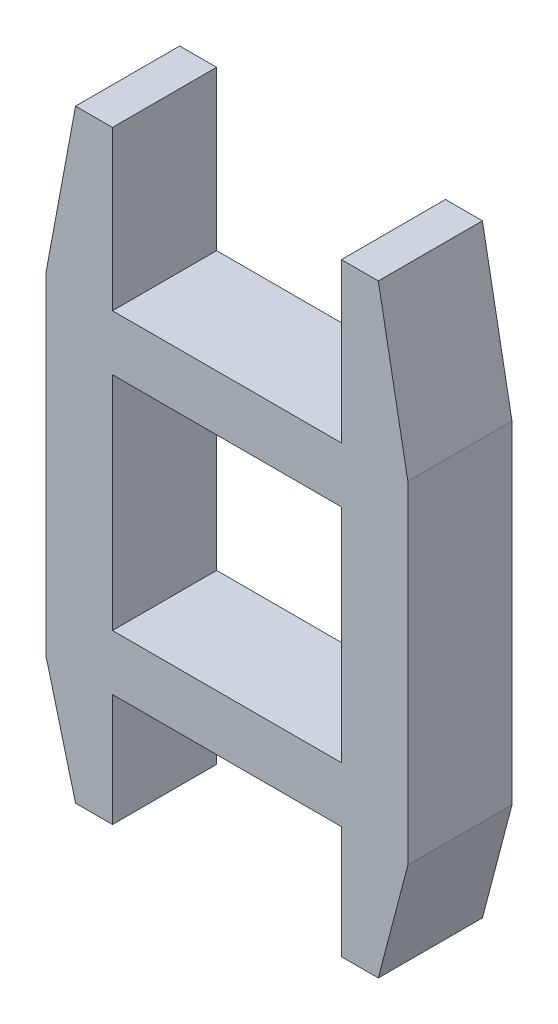
ISO-10303-21;
HEADER;
FILE_DESCRIPTION(('STEP AP214'),'2;1');
FILE_NAME('part.step','',(''),(''),'','','');
FILE_SCHEMA(('AUTOMOTIVE_DESIGN { 1 0 10303 214 1 1 1 1 }'));
ENDSEC;
DATA;
#1=APPLICATION_CONTEXT('core data for automotive mechanical design processes');
#2=APPLICATION_PROTOCOL_DEFINITION('international standard','automotive_design',2000,#1);
#3=PRODUCT_CONTEXT('',#1,'mechanical');
#4=PRODUCT('Part','Part','',(#3));
#5=PRODUCT_RELATED_PRODUCT_CATEGORY('part','',(#4));
#6=PRODUCT_DEFINITION_FORMATION('','',#4);
#7=PRODUCT_DEFINITION_CONTEXT('part definition',#1,'design');
#8=PRODUCT_DEFINITION('design','',#6,#7);
#9=PRODUCT_DEFINITION_SHAPE('','',#8);
#10=(LENGTH_UNIT() NAMED_UNIT(*) SI_UNIT(.MILLI.,.METRE.));
#11=(NAMED_UNIT(*) PLANE_ANGLE_UNIT() SI_UNIT($,.RADIAN.));
#12=(NAMED_UNIT(*) SI_UNIT($,.STERADIAN.) SOLID_ANGLE_UNIT());
#13=UNCERTAINTY_MEASURE_WITH_UNIT(LENGTH_MEASURE(1.E-05),#10,'distance_accuracy_value','');
#14=(GEOMETRIC_REPRESENTATION_CONTEXT(3) GLOBAL_UNCERTAINTY_ASSIGNED_CONTEXT((#13)) GLOBAL_UNIT_ASSIGNED_CONTEXT((#10,
#11,#12)) REPRESENTATION_CONTEXT('',''));
#15=CARTESIAN_POINT('',(0.,0.,0.));
#16=DIRECTION('',(0.,0.,1.));
#17=DIRECTION('',(1.,0.,0.));
#18=AXIS2_PLACEMENT_3D('',#15,#16,#17);
#19=CARTESIAN_POINT('',(1247.20962355286,946.877195660845,5.64));
#20=DIRECTION('',(0.,0.,1.));
#21=DIRECTION('',(1.,0.,0.));
#22=AXIS2_PLACEMENT_3D('',#19,#20,#21);
#23=PLANE('',#22);
#24=DIRECTION('',(0.,1.,0.));
#25=VECTOR('',#24,1.);
#26=CARTESIAN_POINT('',(1247.20962355286,940.777195660845,5.64));
#27=LINE('',#26,#25);
#28=CARTESIAN_POINT('',(1247.20962355286,940.777195660845,5.64));
#29=VERTEX_POINT('',#28);
#30=CARTESIAN_POINT('',(1247.20962355286,946.877195660845,5.64));
#31=VERTEX_POINT('',#30);
#32=EDGE_CURVE('E206',#29,#31,#27,.T.);
#33=ORIENTED_EDGE('',*,*,#32,.T.);
#34=DIRECTION('',(1.,0.,0.));
#35=VECTOR('',#34,1.);
#36=CARTESIAN_POINT('',(1259.60962355286,946.877195660845,5.64));
#37=LINE('',#36,#35);
#38=CARTESIAN_POINT('',(1259.60962355286,946.877195660845,5.64));
#39=VERTEX_POINT('',#38);
#40=EDGE_CURVE('E209',#31,#39,#37,.T.);
#41=ORIENTED_EDGE('',*,*,#40,.T.);
#42=DIRECTION('',(0.,-1.,0.));
#43=VECTOR('',#42,1.);
#44=CARTESIAN_POINT('',(1259.60962355286,940.777195660845,5.64));
#45=LINE('',#44,#43);
#46=CARTESIAN_POINT('',(1259.60962355286,940.777195660845,5.64));
#47=VERTEX_POINT('',#46);
#48=EDGE_CURVE('E212',#39,#47,#45,.T.);
#49=ORIENTED_EDGE('',*,*,#48,.T.);
#50=DIRECTION('',(1.,0.,0.));
#51=VECTOR('',#50,1.);
#52=CARTESIAN_POINT('',(1261.60962355286,940.777195660845,5.64));
#53=LINE('',#52,#51);
#54=CARTESIAN_POINT('',(1261.60962355286,940.777195660845,5.64));
#55=VERTEX_POINT('',#54);
#56=EDGE_CURVE('E214',#47,#55,#53,.T.);
#57=ORIENTED_EDGE('',*,*,#56,.T.);
#58=DIRECTION('',(0.253712688364942,0.967279624391331,0.));
#59=VECTOR('',#58,1.);
#60=CARTESIAN_POINT('',(1263.20962355286,946.877195660845,5.64));
#61=LINE('',#60,#59);
#62=CARTESIAN_POINT('',(1263.20962355286,946.877195660845,5.64));
#63=VERTEX_POINT('',#62);
#64=EDGE_CURVE('E216',#55,#63,#61,.T.);
#65=ORIENTED_EDGE('',*,*,#64,.T.);
#66=DIRECTION('',(0.,1.,0.));
#67=VECTOR('',#66,1.);
#68=CARTESIAN_POINT('',(1263.20962355286,964.877195660845,5.64));
#69=LINE('',#68,#67);
#70=CARTESIAN_POINT('',(1263.20962355286,964.877195660845,5.64));
#71=VERTEX_POINT('',#70);
#72=EDGE_CURVE('E218',#63,#71,#69,.T.);
#73=ORIENTED_EDGE('',*,*,#72,.T.);
#74=DIRECTION('',(-0.182907916182994,0.983130049483584,0.));
#75=VECTOR('',#74,1.);
#76=CARTESIAN_POINT('',(1263.20962355286,964.877195660845,5.64));
#77=LINE('',#76,#75);
#78=CARTESIAN_POINT('',(1261.60962355286,973.477195660846,5.64));
#79=VERTEX_POINT('',#78);
#80=EDGE_CURVE('E220',#71,#79,#77,.T.);
#81=ORIENTED_EDGE('',*,*,#80,.T.);
#82=DIRECTION('',(-1.,0.,0.));
#83=VECTOR('',#82,1.);
#84=CARTESIAN_POINT('',(1261.60962355286,973.477195660846,5.64));
#85=LINE('',#84,#83);
#86=CARTESIAN_POINT('',(1259.60962355286,973.477195660846,5.64));
#87=VERTEX_POINT('',#86);
#88=EDGE_CURVE('E222',#79,#87,#85,.T.);
#89=ORIENTED_EDGE('',*,*,#88,.T.);
#90=DIRECTION('',(0.,-1.,0.));
#91=VECTOR('',#90,1.);
#92=CARTESIAN_POINT('',(1259.60962355286,973.477195660846,5.64));
#93=LINE('',#92,#91);
#94=CARTESIAN_POINT('',(1259.60962355286,964.877195660845,5.64));
#95=VERTEX_POINT('',#94);
#96=EDGE_CURVE('E224',#87,#95,#93,.T.);
#97=ORIENTED_EDGE('',*,*,#96,.T.);
#98=DIRECTION('',(-1.,0.,0.));
#99=VECTOR('',#98,1.);
#100=CARTESIAN_POINT('',(1259.60962355286,964.877195660845,5.64));
#101=LINE('',#100,#99);
#102=CARTESIAN_POINT('',(1247.20962355286,964.877195660845,5.64));
#103=VERTEX_POINT('',#102);
#104=EDGE_CURVE('E226',#95,#103,#101,.T.);
#105=ORIENTED_EDGE('',*,*,#104,.T.);
#106=DIRECTION('',(0.,1.,0.));
#107=VECTOR('',#106,1.);
#108=CARTESIAN_POINT('',(1247.20962355286,973.477195660846,5.64));
#109=LINE('',#108,#107);
#110=CARTESIAN_POINT('',(1247.20962355286,973.477195660846,5.64));
#111=VERTEX_POINT('',#110);
#112=EDGE_CURVE('E228',#103,#111,#109,.T.);
#113=ORIENTED_EDGE('',*,*,#112,.T.);
#114=DIRECTION('',(-1.,0.,0.));
#115=VECTOR('',#114,1.);
#116=CARTESIAN_POINT('',(1245.20962355286,973.477195660846,5.64));
#117=LINE('',#116,#115);
#118=CARTESIAN_POINT('',(1245.20962355286,973.477195660846,5.64));
#119=VERTEX_POINT('',#118);
#120=EDGE_CURVE('E230',#111,#119,#117,.T.);
#121=ORIENTED_EDGE('',*,*,#120,.T.);
#122=DIRECTION('',(-0.182907916182994,-0.983130049483584,0.));
#123=VECTOR('',#122,1.);
#124=CARTESIAN_POINT('',(1243.60962355286,964.877195660845,5.64));
#125=LINE('',#124,#123);
#126=CARTESIAN_POINT('',(1243.60962355286,964.877195660845,5.64));
#127=VERTEX_POINT('',#126);
#128=EDGE_CURVE('E232',#119,#127,#125,.T.);
#129=ORIENTED_EDGE('',*,*,#128,.T.);
#130=DIRECTION('',(0.,-1.,0.));
#131=VECTOR('',#130,1.);
#132=CARTESIAN_POINT('',(1243.60962355286,964.877195660845,5.64));
#133=LINE('',#132,#131);
#134=CARTESIAN_POINT('',(1243.60962355286,946.877195660845,5.64));
#135=VERTEX_POINT('',#134);
#136=EDGE_CURVE('E234',#127,#135,#133,.T.);
#137=ORIENTED_EDGE('',*,*,#136,.T.);
#138=DIRECTION('',(0.253712688364942,-0.967279624391331,0.));
#139=VECTOR('',#138,1.);
#140=CARTESIAN_POINT('',(1243.60962355286,946.877195660845,5.64));
#141=LINE('',#140,#139);
#142=CARTESIAN_POINT('',(1245.20962355286,940.777195660845,5.64));
#143=VERTEX_POINT('',#142);
#144=EDGE_CURVE('E236',#135,#143,#141,.T.);
#145=ORIENTED_EDGE('',*,*,#144,.T.);
#146=DIRECTION('',(1.,0.,0.));
#147=VECTOR('',#146,1.);
#148=CARTESIAN_POINT('',(1245.20962355286,940.777195660845,5.64));
#149=LINE('',#148,#147);
#150=EDGE_CURVE('E238',#143,#29,#149,.T.);
#151=ORIENTED_EDGE('',*,*,#150,.T.);
#152=EDGE_LOOP('',(#33,#41,#49,#57,#65,#73,#81,#89,#97,#105,#113,#121,#129,#137,#145,#151));
#153=FACE_BOUND('',#152,.T.);
#154=DIRECTION('',(-1.,0.,0.));
#155=VECTOR('',#154,1.);
#156=CARTESIAN_POINT('',(1247.20962355286,961.877195660845,5.64));
#157=LINE('',#156,#155);
#158=CARTESIAN_POINT('',(1259.60962355286,961.877195660845,5.64));
#159=VERTEX_POINT('',#158);
#160=CARTESIAN_POINT('',(1247.20962355286,961.877195660845,5.64));
#161=VERTEX_POINT('',#160);
#162=EDGE_CURVE('E178',#159,#161,#157,.T.);
#163=ORIENTED_EDGE('',*,*,#162,.F.);
#164=DIRECTION('',(0.,1.,0.));
#165=VECTOR('',#164,1.);
#166=CARTESIAN_POINT('',(1259.60962355286,961.877195660845,5.64));
#167=LINE('',#166,#165);
#168=CARTESIAN_POINT('',(1259.60962355286,949.877195660845,5.64));
#169=VERTEX_POINT('',#168);
#170=EDGE_CURVE('E170',#169,#159,#167,.T.);
#171=ORIENTED_EDGE('',*,*,#170,.F.);
#172=DIRECTION('',(1.,0.,0.));
#173=VECTOR('',#172,1.);
#174=CARTESIAN_POINT('',(1247.20962355286,949.877195660845,5.64));
#175=LINE('',#174,#173);
#176=CARTESIAN_POINT('',(1247.20962355286,949.877195660845,5.64));
#177=VERTEX_POINT('',#176);
#178=EDGE_CURVE('E192',#177,#169,#175,.T.);
#179=ORIENTED_EDGE('',*,*,#178,.F.);
#180=DIRECTION('',(0.,-1.,0.));
#181=VECTOR('',#180,1.);
#182=CARTESIAN_POINT('',(1247.20962355286,961.877195660845,5.64));
#183=LINE('',#182,#181);
#184=EDGE_CURVE('E190',#161,#177,#183,.T.);
#185=ORIENTED_EDGE('',*,*,#184,.F.);
#186=EDGE_LOOP('',(#163,#171,#179,#185));
#187=FACE_BOUND('',#186,.T.);
#188=ADVANCED_FACE('F33',(#153,#187),#23,.T.);
#189=CARTESIAN_POINT('',(1247.20962355286,946.877195660845,0.));
#190=DIRECTION('',(0.,0.,1.));
#191=DIRECTION('',(1.,0.,0.));
#192=AXIS2_PLACEMENT_3D('',#189,#190,#191);
#193=PLANE('',#192);
#194=DIRECTION('',(0.,1.,0.));
#195=VECTOR('',#194,1.);
#196=CARTESIAN_POINT('',(1247.20962355286,940.777195660845,0.));
#197=LINE('',#196,#195);
#198=CARTESIAN_POINT('',(1247.20962355286,940.777195660845,0.));
#199=VERTEX_POINT('',#198);
#200=CARTESIAN_POINT('',(1247.20962355286,946.877195660845,0.));
#201=VERTEX_POINT('',#200);
#202=EDGE_CURVE('E186',#199,#201,#197,.T.);
#203=ORIENTED_EDGE('',*,*,#202,.F.);
#204=DIRECTION('',(1.,0.,0.));
#205=VECTOR('',#204,1.);
#206=CARTESIAN_POINT('',(1245.20962355286,940.777195660845,0.));
#207=LINE('',#206,#205);
#208=CARTESIAN_POINT('',(1245.20962355286,940.777195660845,0.));
#209=VERTEX_POINT('',#208);
#210=EDGE_CURVE('E210',#209,#199,#207,.T.);
#211=ORIENTED_EDGE('',*,*,#210,.F.);
#212=DIRECTION('',(0.253712688364942,-0.967279624391331,0.));
#213=VECTOR('',#212,1.);
#214=CARTESIAN_POINT('',(1243.60962355286,946.877195660845,0.));
#215=LINE('',#214,#213);
#216=CARTESIAN_POINT('',(1243.60962355286,946.877195660845,0.));
#217=VERTEX_POINT('',#216);
#218=EDGE_CURVE('E269',#217,#209,#215,.T.);
#219=ORIENTED_EDGE('',*,*,#218,.F.);
#220=DIRECTION('',(0.,-1.,0.));
#221=VECTOR('',#220,1.);
#222=CARTESIAN_POINT('',(1243.60962355286,964.877195660845,0.));
#223=LINE('',#222,#221);
#224=CARTESIAN_POINT('',(1243.60962355286,964.877195660845,0.));
#225=VERTEX_POINT('',#224);
#226=EDGE_CURVE('E267',#225,#217,#223,.T.);
#227=ORIENTED_EDGE('',*,*,#226,.F.);
#228=DIRECTION('',(-0.182907916182994,-0.983130049483584,0.));
#229=VECTOR('',#228,1.);
#230=CARTESIAN_POINT('',(1243.60962355286,964.877195660845,0.));
#231=LINE('',#230,#229);
#232=CARTESIAN_POINT('',(1245.20962355286,973.477195660846,0.));
#233=VERTEX_POINT('',#232);
#234=EDGE_CURVE('E265',#233,#225,#231,.T.);
#235=ORIENTED_EDGE('',*,*,#234,.F.);
#236=DIRECTION('',(-1.,0.,0.));
#237=VECTOR('',#236,1.);
#238=CARTESIAN_POINT('',(1245.20962355286,973.477195660846,0.));
#239=LINE('',#238,#237);
#240=CARTESIAN_POINT('',(1247.20962355286,973.477195660846,0.));
#241=VERTEX_POINT('',#240);
#242=EDGE_CURVE('E263',#241,#233,#239,.T.);
#243=ORIENTED_EDGE('',*,*,#242,.F.);
#244=DIRECTION('',(0.,1.,0.));
#245=VECTOR('',#244,1.);
#246=CARTESIAN_POINT('',(1247.20962355286,973.477195660846,0.));
#247=LINE('',#246,#245);
#248=CARTESIAN_POINT('',(1247.20962355286,964.877195660845,0.));
#249=VERTEX_POINT('',#248);
#250=EDGE_CURVE('E261',#249,#241,#247,.T.);
#251=ORIENTED_EDGE('',*,*,#250,.F.);
#252=DIRECTION('',(-1.,0.,0.));
#253=VECTOR('',#252,1.);
#254=CARTESIAN_POINT('',(1259.60962355286,964.877195660845,0.));
#255=LINE('',#254,#253);
#256=CARTESIAN_POINT('',(1259.60962355286,964.877195660845,0.));
#257=VERTEX_POINT('',#256);
#258=EDGE_CURVE('E259',#257,#249,#255,.T.);
#259=ORIENTED_EDGE('',*,*,#258,.F.);
#260=DIRECTION('',(0.,-1.,0.));
#261=VECTOR('',#260,1.);
#262=CARTESIAN_POINT('',(1259.60962355286,973.477195660846,0.));
#263=LINE('',#262,#261);
#264=CARTESIAN_POINT('',(1259.60962355286,973.477195660846,0.));
#265=VERTEX_POINT('',#264);
#266=EDGE_CURVE('E257',#265,#257,#263,.T.);
#267=ORIENTED_EDGE('',*,*,#266,.F.);
#268=DIRECTION('',(-1.,0.,0.));
#269=VECTOR('',#268,1.);
#270=CARTESIAN_POINT('',(1261.60962355286,973.477195660846,0.));
#271=LINE('',#270,#269);
#272=CARTESIAN_POINT('',(1261.60962355286,973.477195660846,0.));
#273=VERTEX_POINT('',#272);
#274=EDGE_CURVE('E255',#273,#265,#271,.T.);
#275=ORIENTED_EDGE('',*,*,#274,.F.);
#276=DIRECTION('',(-0.182907916182994,0.983130049483584,0.));
#277=VECTOR('',#276,1.);
#278=CARTESIAN_POINT('',(1263.20962355286,964.877195660845,0.));
#279=LINE('',#278,#277);
#280=CARTESIAN_POINT('',(1263.20962355286,964.877195660845,0.));
#281=VERTEX_POINT('',#280);
#282=EDGE_CURVE('E253',#281,#273,#279,.T.);
#283=ORIENTED_EDGE('',*,*,#282,.F.);
#284=DIRECTION('',(0.,1.,0.));
#285=VECTOR('',#284,1.);
#286=CARTESIAN_POINT('',(1263.20962355286,964.877195660845,0.));
#287=LINE('',#286,#285);
#288=CARTESIAN_POINT('',(1263.20962355286,946.877195660845,0.));
#289=VERTEX_POINT('',#288);
#290=EDGE_CURVE('E251',#289,#281,#287,.T.);
#291=ORIENTED_EDGE('',*,*,#290,.F.);
#292=DIRECTION('',(0.253712688364942,0.967279624391331,0.));
#293=VECTOR('',#292,1.);
#294=CARTESIAN_POINT('',(1263.20962355286,946.877195660845,0.));
#295=LINE('',#294,#293);
#296=CARTESIAN_POINT('',(1261.60962355286,940.777195660845,0.));
#297=VERTEX_POINT('',#296);
#298=EDGE_CURVE('E249',#297,#289,#295,.T.);
#299=ORIENTED_EDGE('',*,*,#298,.F.);
#300=DIRECTION('',(1.,0.,0.));
#301=VECTOR('',#300,1.);
#302=CARTESIAN_POINT('',(1261.60962355286,940.777195660845,0.));
#303=LINE('',#302,#301);
#304=CARTESIAN_POINT('',(1259.60962355286,940.777195660845,0.));
#305=VERTEX_POINT('',#304);
#306=EDGE_CURVE('E247',#305,#297,#303,.T.);
#307=ORIENTED_EDGE('',*,*,#306,.F.);
#308=DIRECTION('',(0.,-1.,0.));
#309=VECTOR('',#308,1.);
#310=CARTESIAN_POINT('',(1259.60962355286,940.777195660845,0.));
#311=LINE('',#310,#309);
#312=CARTESIAN_POINT('',(1259.60962355286,946.877195660845,0.));
#313=VERTEX_POINT('',#312);
#314=EDGE_CURVE('E245',#313,#305,#311,.T.);
#315=ORIENTED_EDGE('',*,*,#314,.F.);
#316=DIRECTION('',(1.,0.,0.));
#317=VECTOR('',#316,1.);
#318=CARTESIAN_POINT('',(1259.60962355286,946.877195660845,0.));
#319=LINE('',#318,#317);
#320=EDGE_CURVE('E243',#201,#313,#319,.T.);
#321=ORIENTED_EDGE('',*,*,#320,.F.);
#322=EDGE_LOOP('',(#203,#211,#219,#227,#235,#243,#251,#259,#267,#275,#283,#291,#299,#307,#315,#321));
#323=FACE_BOUND('',#322,.T.);
#324=DIRECTION('',(0.,1.,0.));
#325=VECTOR('',#324,1.);
#326=CARTESIAN_POINT('',(1259.60962355286,961.877195660845,0.));
#327=LINE('',#326,#325);
#328=CARTESIAN_POINT('',(1259.60962355286,949.877195660845,0.));
#329=VERTEX_POINT('',#328);
#330=CARTESIAN_POINT('',(1259.60962355286,961.877195660845,0.));
#331=VERTEX_POINT('',#330);
#332=EDGE_CURVE('E56',#329,#331,#327,.T.);
#333=ORIENTED_EDGE('',*,*,#332,.T.);
#334=DIRECTION('',(-1.,0.,0.));
#335=VECTOR('',#334,1.);
#336=CARTESIAN_POINT('',(1247.20962355286,961.877195660845,0.));
#337=LINE('',#336,#335);
#338=CARTESIAN_POINT('',(1247.20962355286,961.877195660845,0.));
#339=VERTEX_POINT('',#338);
#340=EDGE_CURVE('E185',#331,#339,#337,.T.);
#341=ORIENTED_EDGE('',*,*,#340,.T.);
#342=DIRECTION('',(0.,-1.,0.));
#343=VECTOR('',#342,1.);
#344=CARTESIAN_POINT('',(1247.20962355286,961.877195660845,0.));
#345=LINE('',#344,#343);
#346=CARTESIAN_POINT('',(1247.20962355286,949.877195660845,0.));
#347=VERTEX_POINT('',#346);
#348=EDGE_CURVE('E198',#339,#347,#345,.T.);
#349=ORIENTED_EDGE('',*,*,#348,.T.);
#350=DIRECTION('',(1.,0.,0.));
#351=VECTOR('',#350,1.);
#352=CARTESIAN_POINT('',(1247.20962355286,949.877195660845,0.));
#353=LINE('',#352,#351);
#354=EDGE_CURVE('E179',#347,#329,#353,.T.);
#355=ORIENTED_EDGE('',*,*,#354,.T.);
#356=EDGE_LOOP('',(#333,#341,#349,#355));
#357=FACE_BOUND('',#356,.T.);
#358=ADVANCED_FACE('F323',(#323,#357),#193,.F.);
#359=CARTESIAN_POINT('',(1247.20962355286,940.777195660845,5.64));
#360=DIRECTION('',(-1.,0.,0.));
#361=DIRECTION('',(0.,-1.,0.));
#362=AXIS2_PLACEMENT_3D('',#359,#360,#361);
#363=PLANE('',#362);
#364=ORIENTED_EDGE('',*,*,#202,.T.);
#365=DIRECTION('',(0.,0.,-1.));
#366=VECTOR('',#365,1.);
#367=CARTESIAN_POINT('',(1247.20962355286,946.877195660845,5.64));
#368=LINE('',#367,#366);
#369=EDGE_CURVE('E11',#31,#201,#368,.T.);
#370=ORIENTED_EDGE('',*,*,#369,.F.);
#371=ORIENTED_EDGE('',*,*,#32,.F.);
#372=DIRECTION('',(0.,0.,-1.));
#373=VECTOR('',#372,1.);
#374=CARTESIAN_POINT('',(1247.20962355286,940.777195660845,5.64));
#375=LINE('',#374,#373);
#376=EDGE_CURVE('E240',#29,#199,#375,.T.);
#377=ORIENTED_EDGE('',*,*,#376,.T.);
#378=EDGE_LOOP('',(#364,#370,#371,#377));
#379=FACE_BOUND('',#378,.T.);
#380=ADVANCED_FACE('F35',(#379),#363,.F.);
#381=CARTESIAN_POINT('',(1259.60962355286,946.877195660845,5.64));
#382=DIRECTION('',(0.,1.,0.));
#383=DIRECTION('',(0.,0.,1.));
#384=AXIS2_PLACEMENT_3D('',#381,#382,#383);
#385=PLANE('',#384);
#386=ORIENTED_EDGE('',*,*,#320,.T.);
#387=DIRECTION('',(0.,0.,-1.));
#388=VECTOR('',#387,1.);
#389=CARTESIAN_POINT('',(1259.60962355286,946.877195660845,5.64));
#390=LINE('',#389,#388);
#391=EDGE_CURVE('E41',#39,#313,#390,.T.);
#392=ORIENTED_EDGE('',*,*,#391,.F.);
#393=ORIENTED_EDGE('',*,*,#40,.F.);
#394=ORIENTED_EDGE('',*,*,#369,.T.);
#395=EDGE_LOOP('',(#386,#392,#393,#394));
#396=FACE_BOUND('',#395,.T.);
#397=ADVANCED_FACE('F340',(#396),#385,.F.);
#398=CARTESIAN_POINT('',(1259.60962355286,940.777195660845,5.64));
#399=DIRECTION('',(1.,0.,0.));
#400=DIRECTION('',(0.,1.,0.));
#401=AXIS2_PLACEMENT_3D('',#398,#399,#400);
#402=PLANE('',#401);
#403=ORIENTED_EDGE('',*,*,#314,.T.);
#404=DIRECTION('',(0.,0.,-1.));
#405=VECTOR('',#404,1.);
#406=CARTESIAN_POINT('',(1259.60962355286,940.777195660845,5.64));
#407=LINE('',#406,#405);
#408=EDGE_CURVE('E310',#47,#305,#407,.T.);
#409=ORIENTED_EDGE('',*,*,#408,.F.);
#410=ORIENTED_EDGE('',*,*,#48,.F.);
#411=ORIENTED_EDGE('',*,*,#391,.T.);
#412=EDGE_LOOP('',(#403,#409,#410,#411));
#413=FACE_BOUND('',#412,.T.);
#414=ADVANCED_FACE('F317',(#413),#402,.F.);
#415=CARTESIAN_POINT('',(1261.60962355286,940.777195660845,5.64));
#416=DIRECTION('',(0.,1.,0.));
#417=DIRECTION('',(0.,0.,1.));
#418=AXIS2_PLACEMENT_3D('',#415,#416,#417);
#419=PLANE('',#418);
#420=ORIENTED_EDGE('',*,*,#306,.T.);
#421=DIRECTION('',(0.,0.,-1.));
#422=VECTOR('',#421,1.);
#423=CARTESIAN_POINT('',(1261.60962355286,940.777195660845,5.64));
#424=LINE('',#423,#422);
#425=EDGE_CURVE('E307',#55,#297,#424,.T.);
#426=ORIENTED_EDGE('',*,*,#425,.F.);
#427=ORIENTED_EDGE('',*,*,#56,.F.);
#428=ORIENTED_EDGE('',*,*,#408,.T.);
#429=EDGE_LOOP('',(#420,#426,#427,#428));
#430=FACE_BOUND('',#429,.T.);
#431=ADVANCED_FACE('F329',(#430),#419,.F.);
#432=CARTESIAN_POINT('',(1263.20962355286,946.877195660845,5.64));
#433=DIRECTION('',(-0.967279624391331,0.253712688364942,0.));
#434=DIRECTION('',(-0.253712688364942,-0.967279624391331,0.));
#435=AXIS2_PLACEMENT_3D('',#432,#433,#434);
#436=PLANE('',#435);
#437=ORIENTED_EDGE('',*,*,#298,.T.);
#438=DIRECTION('',(0.,0.,-1.));
#439=VECTOR('',#438,1.);
#440=CARTESIAN_POINT('',(1263.20962355286,946.877195660845,5.64));
#441=LINE('',#440,#439);
#442=EDGE_CURVE('E304',#63,#289,#441,.T.);
#443=ORIENTED_EDGE('',*,*,#442,.F.);
#444=ORIENTED_EDGE('',*,*,#64,.F.);
#445=ORIENTED_EDGE('',*,*,#425,.T.);
#446=EDGE_LOOP('',(#437,#443,#444,#445));
#447=FACE_BOUND('',#446,.T.);
#448=ADVANCED_FACE('F333',(#447),#436,.F.);
#449=CARTESIAN_POINT('',(1263.20962355286,964.877195660845,5.64));
#450=DIRECTION('',(-1.,0.,0.));
#451=DIRECTION('',(0.,0.,1.));
#452=AXIS2_PLACEMENT_3D('',#449,#450,#451);
#453=PLANE('',#452);
#454=ORIENTED_EDGE('',*,*,#290,.T.);
#455=DIRECTION('',(0.,0.,-1.));
#456=VECTOR('',#455,1.);
#457=CARTESIAN_POINT('',(1263.20962355286,964.877195660845,5.64));
#458=LINE('',#457,#456);
#459=EDGE_CURVE('E301',#71,#281,#458,.T.);
#460=ORIENTED_EDGE('',*,*,#459,.F.);
#461=ORIENTED_EDGE('',*,*,#72,.F.);
#462=ORIENTED_EDGE('',*,*,#442,.T.);
#463=EDGE_LOOP('',(#454,#460,#461,#462));
#464=FACE_BOUND('',#463,.T.);
#465=ADVANCED_FACE('F393',(#464),#453,.F.);
#466=CARTESIAN_POINT('',(1263.20962355286,964.877195660845,5.64));
#467=DIRECTION('',(-0.983130049483584,-0.182907916182994,0.));
#468=DIRECTION('',(0.182907916182994,-0.983130049483584,0.));
#469=AXIS2_PLACEMENT_3D('',#466,#467,#468);
#470=PLANE('',#469);
#471=ORIENTED_EDGE('',*,*,#282,.T.);
#472=DIRECTION('',(0.,0.,-1.));
#473=VECTOR('',#472,1.);
#474=CARTESIAN_POINT('',(1261.60962355286,973.477195660846,5.64));
#475=LINE('',#474,#473);
#476=EDGE_CURVE('E298',#79,#273,#475,.T.);
#477=ORIENTED_EDGE('',*,*,#476,.F.);
#478=ORIENTED_EDGE('',*,*,#80,.F.);
#479=ORIENTED_EDGE('',*,*,#459,.T.);
#480=EDGE_LOOP('',(#471,#477,#478,#479));
#481=FACE_BOUND('',#480,.T.);
#482=ADVANCED_FACE('F390',(#481),#470,.F.);
#483=CARTESIAN_POINT('',(1261.60962355286,973.477195660846,5.64));
#484=DIRECTION('',(0.,-1.,0.));
#485=DIRECTION('',(0.,0.,-1.));
#486=AXIS2_PLACEMENT_3D('',#483,#484,#485);
#487=PLANE('',#486);
#488=ORIENTED_EDGE('',*,*,#274,.T.);
#489=DIRECTION('',(0.,0.,-1.));
#490=VECTOR('',#489,1.);
#491=CARTESIAN_POINT('',(1259.60962355286,973.477195660846,5.64));
#492=LINE('',#491,#490);
#493=EDGE_CURVE('E295',#87,#265,#492,.T.);
#494=ORIENTED_EDGE('',*,*,#493,.F.);
#495=ORIENTED_EDGE('',*,*,#88,.F.);
#496=ORIENTED_EDGE('',*,*,#476,.T.);
#497=EDGE_LOOP('',(#488,#494,#495,#496));
#498=FACE_BOUND('',#497,.T.);
#499=ADVANCED_FACE('F386',(#498),#487,.F.);
#500=CARTESIAN_POINT('',(1259.60962355286,973.477195660846,5.64));
#501=DIRECTION('',(1.,0.,0.));
#502=DIRECTION('',(0.,0.,-1.));
#503=AXIS2_PLACEMENT_3D('',#500,#501,#502);
#504=PLANE('',#503);
#505=ORIENTED_EDGE('',*,*,#266,.T.);
#506=DIRECTION('',(0.,0.,-1.));
#507=VECTOR('',#506,1.);
#508=CARTESIAN_POINT('',(1259.60962355286,964.877195660845,5.64));
#509=LINE('',#508,#507);
#510=EDGE_CURVE('E292',#95,#257,#509,.T.);
#511=ORIENTED_EDGE('',*,*,#510,.F.);
#512=ORIENTED_EDGE('',*,*,#96,.F.);
#513=ORIENTED_EDGE('',*,*,#493,.T.);
#514=EDGE_LOOP('',(#505,#511,#512,#513));
#515=FACE_BOUND('',#514,.T.);
#516=ADVANCED_FACE('F382',(#515),#504,.F.);
#517=CARTESIAN_POINT('',(1259.60962355286,964.877195660845,5.64));
#518=DIRECTION('',(0.,-1.,0.));
#519=DIRECTION('',(0.,0.,-1.));
#520=AXIS2_PLACEMENT_3D('',#517,#518,#519);
#521=PLANE('',#520);
#522=ORIENTED_EDGE('',*,*,#258,.T.);
#523=DIRECTION('',(0.,0.,-1.));
#524=VECTOR('',#523,1.);
#525=CARTESIAN_POINT('',(1247.20962355286,964.877195660845,5.64));
#526=LINE('',#525,#524);
#527=EDGE_CURVE('E289',#103,#249,#526,.T.);
#528=ORIENTED_EDGE('',*,*,#527,.F.);
#529=ORIENTED_EDGE('',*,*,#104,.F.);
#530=ORIENTED_EDGE('',*,*,#510,.T.);
#531=EDGE_LOOP('',(#522,#528,#529,#530));
#532=FACE_BOUND('',#531,.T.);
#533=ADVANCED_FACE('F377',(#532),#521,.F.);
#534=CARTESIAN_POINT('',(1247.20962355286,973.477195660846,5.64));
#535=DIRECTION('',(-1.,0.,0.));
#536=DIRECTION('',(0.,0.,1.));
#537=AXIS2_PLACEMENT_3D('',#534,#535,#536);
#538=PLANE('',#537);
#539=ORIENTED_EDGE('',*,*,#250,.T.);
#540=DIRECTION('',(0.,0.,-1.));
#541=VECTOR('',#540,1.);
#542=CARTESIAN_POINT('',(1247.20962355286,973.477195660846,5.64));
#543=LINE('',#542,#541);
#544=EDGE_CURVE('E286',#111,#241,#543,.T.);
#545=ORIENTED_EDGE('',*,*,#544,.F.);
#546=ORIENTED_EDGE('',*,*,#112,.F.);
#547=ORIENTED_EDGE('',*,*,#527,.T.);
#548=EDGE_LOOP('',(#539,#545,#546,#547));
#549=FACE_BOUND('',#548,.T.);
#550=ADVANCED_FACE('F371',(#549),#538,.F.);
#551=CARTESIAN_POINT('',(1245.20962355286,973.477195660846,5.64));
#552=DIRECTION('',(0.,-1.,0.));
#553=DIRECTION('',(0.,0.,-1.));
#554=AXIS2_PLACEMENT_3D('',#551,#552,#553);
#555=PLANE('',#554);
#556=ORIENTED_EDGE('',*,*,#242,.T.);
#557=DIRECTION('',(0.,0.,-1.));
#558=VECTOR('',#557,1.);
#559=CARTESIAN_POINT('',(1245.20962355286,973.477195660846,5.64));
#560=LINE('',#559,#558);
#561=EDGE_CURVE('E283',#119,#233,#560,.T.);
#562=ORIENTED_EDGE('',*,*,#561,.F.);
#563=ORIENTED_EDGE('',*,*,#120,.F.);
#564=ORIENTED_EDGE('',*,*,#544,.T.);
#565=EDGE_LOOP('',(#556,#562,#563,#564));
#566=FACE_BOUND('',#565,.T.);
#567=ADVANCED_FACE('F367',(#566),#555,.F.);
#568=CARTESIAN_POINT('',(1243.60962355286,964.877195660845,5.64));
#569=DIRECTION('',(0.983130049483584,-0.182907916182994,0.));
#570=DIRECTION('',(0.182907916182994,0.983130049483584,0.));
#571=AXIS2_PLACEMENT_3D('',#568,#569,#570);
#572=PLANE('',#571);
#573=ORIENTED_EDGE('',*,*,#234,.T.);
#574=DIRECTION('',(0.,0.,-1.));
#575=VECTOR('',#574,1.);
#576=CARTESIAN_POINT('',(1243.60962355286,964.877195660845,5.64));
#577=LINE('',#576,#575);
#578=EDGE_CURVE('E280',#127,#225,#577,.T.);
#579=ORIENTED_EDGE('',*,*,#578,.F.);
#580=ORIENTED_EDGE('',*,*,#128,.F.);
#581=ORIENTED_EDGE('',*,*,#561,.T.);
#582=EDGE_LOOP('',(#573,#579,#580,#581));
#583=FACE_BOUND('',#582,.T.);
#584=ADVANCED_FACE('F362',(#583),#572,.F.);
#585=CARTESIAN_POINT('',(1243.60962355286,964.877195660845,5.64));
#586=DIRECTION('',(1.,0.,0.));
#587=DIRECTION('',(0.,0.,-1.));
#588=AXIS2_PLACEMENT_3D('',#585,#586,#587);
#589=PLANE('',#588);
#590=ORIENTED_EDGE('',*,*,#226,.T.);
#591=DIRECTION('',(0.,0.,-1.));
#592=VECTOR('',#591,1.);
#593=CARTESIAN_POINT('',(1243.60962355286,946.877195660845,5.64));
#594=LINE('',#593,#592);
#595=EDGE_CURVE('E277',#135,#217,#594,.T.);
#596=ORIENTED_EDGE('',*,*,#595,.F.);
#597=ORIENTED_EDGE('',*,*,#136,.F.);
#598=ORIENTED_EDGE('',*,*,#578,.T.);
#599=EDGE_LOOP('',(#590,#596,#597,#598));
#600=FACE_BOUND('',#599,.T.);
#601=ADVANCED_FACE('F356',(#600),#589,.F.);
#602=CARTESIAN_POINT('',(1243.60962355286,946.877195660845,5.64));
#603=DIRECTION('',(0.967279624391331,0.253712688364942,0.));
#604=DIRECTION('',(-0.253712688364942,0.967279624391331,0.));
#605=AXIS2_PLACEMENT_3D('',#602,#603,#604);
#606=PLANE('',#605);
#607=ORIENTED_EDGE('',*,*,#218,.T.);
#608=DIRECTION('',(0.,0.,-1.));
#609=VECTOR('',#608,1.);
#610=CARTESIAN_POINT('',(1245.20962355286,940.777195660845,5.64));
#611=LINE('',#610,#609);
#612=EDGE_CURVE('E274',#143,#209,#611,.T.);
#613=ORIENTED_EDGE('',*,*,#612,.F.);
#614=ORIENTED_EDGE('',*,*,#144,.F.);
#615=ORIENTED_EDGE('',*,*,#595,.T.);
#616=EDGE_LOOP('',(#607,#613,#614,#615));
#617=FACE_BOUND('',#616,.T.);
#618=ADVANCED_FACE('F352',(#617),#606,.F.);
#619=CARTESIAN_POINT('',(1245.20962355286,940.777195660845,5.64));
#620=DIRECTION('',(0.,1.,0.));
#621=DIRECTION('',(0.,0.,1.));
#622=AXIS2_PLACEMENT_3D('',#619,#620,#621);
#623=PLANE('',#622);
#624=ORIENTED_EDGE('',*,*,#210,.T.);
#625=ORIENTED_EDGE('',*,*,#376,.F.);
#626=ORIENTED_EDGE('',*,*,#150,.F.);
#627=ORIENTED_EDGE('',*,*,#612,.T.);
#628=EDGE_LOOP('',(#624,#625,#626,#627));
#629=FACE_BOUND('',#628,.T.);
#630=ADVANCED_FACE('F347',(#629),#623,.F.);
#631=CARTESIAN_POINT('',(1259.60962355286,961.877195660845,5.64));
#632=DIRECTION('',(-1.,0.,0.));
#633=DIRECTION('',(0.,0.,1.));
#634=AXIS2_PLACEMENT_3D('',#631,#632,#633);
#635=PLANE('',#634);
#636=ORIENTED_EDGE('',*,*,#332,.F.);
#637=DIRECTION('',(0.,0.,-1.));
#638=VECTOR('',#637,1.);
#639=CARTESIAN_POINT('',(1259.60962355286,949.877195660845,5.64));
#640=LINE('',#639,#638);
#641=EDGE_CURVE('E174',#169,#329,#640,.T.);
#642=ORIENTED_EDGE('',*,*,#641,.F.);
#643=ORIENTED_EDGE('',*,*,#170,.T.);
#644=DIRECTION('',(0.,0.,-1.));
#645=VECTOR('',#644,1.);
#646=CARTESIAN_POINT('',(1259.60962355286,961.877195660845,5.64));
#647=LINE('',#646,#645);
#648=EDGE_CURVE('E173',#159,#331,#647,.T.);
#649=ORIENTED_EDGE('',*,*,#648,.T.);
#650=EDGE_LOOP('',(#636,#642,#643,#649));
#651=FACE_BOUND('',#650,.T.);
#652=ADVANCED_FACE('F172',(#651),#635,.T.);
#653=CARTESIAN_POINT('',(1247.20962355286,961.877195660845,5.64));
#654=DIRECTION('',(0.,-1.,0.));
#655=DIRECTION('',(0.,0.,-1.));
#656=AXIS2_PLACEMENT_3D('',#653,#654,#655);
#657=PLANE('',#656);
#658=ORIENTED_EDGE('',*,*,#340,.F.);
#659=ORIENTED_EDGE('',*,*,#648,.F.);
#660=ORIENTED_EDGE('',*,*,#162,.T.);
#661=DIRECTION('',(0.,0.,-1.));
#662=VECTOR('',#661,1.);
#663=CARTESIAN_POINT('',(1247.20962355286,961.877195660845,5.64));
#664=LINE('',#663,#662);
#665=EDGE_CURVE('E187',#161,#339,#664,.T.);
#666=ORIENTED_EDGE('',*,*,#665,.T.);
#667=EDGE_LOOP('',(#658,#659,#660,#666));
#668=FACE_BOUND('',#667,.T.);
#669=ADVANCED_FACE('F182',(#668),#657,.T.);
#670=CARTESIAN_POINT('',(1247.20962355286,961.877195660845,5.64));
#671=DIRECTION('',(1.,0.,0.));
#672=DIRECTION('',(0.,0.,-1.));
#673=AXIS2_PLACEMENT_3D('',#670,#671,#672);
#674=PLANE('',#673);
#675=ORIENTED_EDGE('',*,*,#348,.F.);
#676=ORIENTED_EDGE('',*,*,#665,.F.);
#677=ORIENTED_EDGE('',*,*,#184,.T.);
#678=DIRECTION('',(0.,0.,-1.));
#679=VECTOR('',#678,1.);
#680=CARTESIAN_POINT('',(1247.20962355286,949.877195660845,5.64));
#681=LINE('',#680,#679);
#682=EDGE_CURVE('E48',#177,#347,#681,.T.);
#683=ORIENTED_EDGE('',*,*,#682,.T.);
#684=EDGE_LOOP('',(#675,#676,#677,#683));
#685=FACE_BOUND('',#684,.T.);
#686=ADVANCED_FACE('F475',(#685),#674,.T.);
#687=CARTESIAN_POINT('',(1247.20962355286,949.877195660845,5.64));
#688=DIRECTION('',(0.,1.,0.));
#689=DIRECTION('',(0.,0.,1.));
#690=AXIS2_PLACEMENT_3D('',#687,#688,#689);
#691=PLANE('',#690);
#692=ORIENTED_EDGE('',*,*,#354,.F.);
#693=ORIENTED_EDGE('',*,*,#682,.F.);
#694=ORIENTED_EDGE('',*,*,#178,.T.);
#695=ORIENTED_EDGE('',*,*,#641,.T.);
#696=EDGE_LOOP('',(#692,#693,#694,#695));
#697=FACE_BOUND('',#696,.T.);
#698=ADVANCED_FACE('F481',(#697),#691,.T.);
#699=CLOSED_SHELL('',(#188,#358,#380,#397,#414,#431,#448,#465,#482,#499,#516,#533,#550,#567,
#584,#601,#618,#630,#652,#669,#686,#698));
#700=MANIFOLD_SOLID_BREP('B2',#699);
#701=ADVANCED_BREP_SHAPE_REPRESENTATION('',(#18,#700),#14);
#702=SHAPE_DEFINITION_REPRESENTATION(#9,#701);
ENDSEC;
END-ISO-10303-21;
